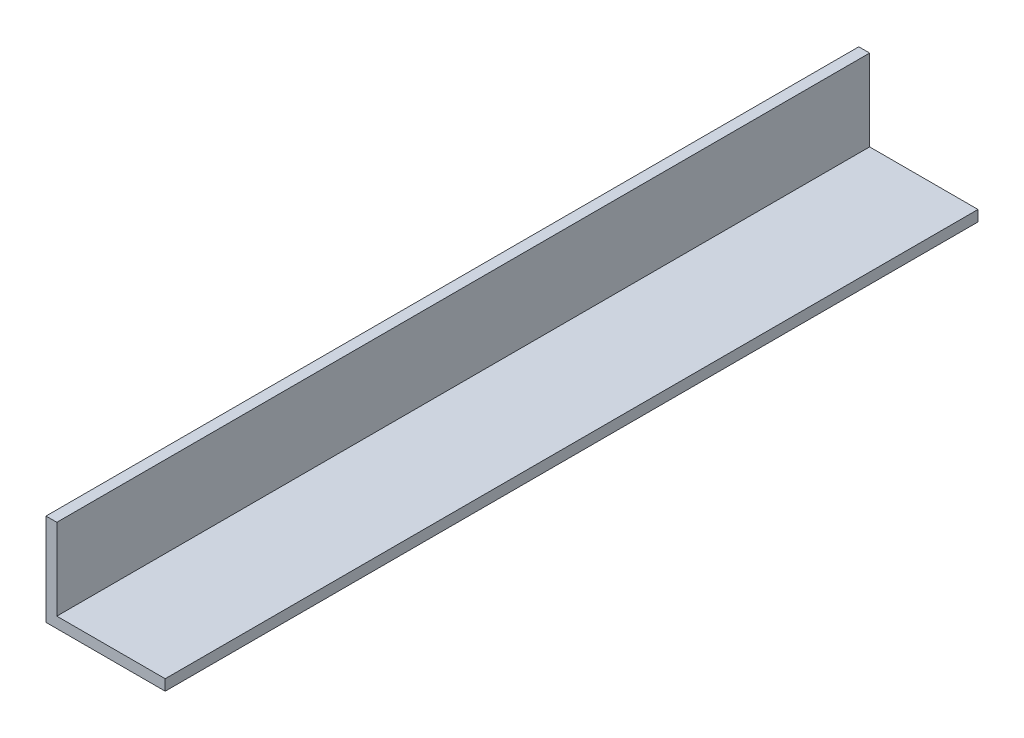
ISO-10303-21;
HEADER;
FILE_DESCRIPTION(('STEP AP214'),'2;1');
FILE_NAME('part.step','',(''),(''),'','','');
FILE_SCHEMA(('AUTOMOTIVE_DESIGN { 1 0 10303 214 1 1 1 1 }'));
ENDSEC;
DATA;
#1=APPLICATION_CONTEXT('core data for automotive mechanical design processes');
#2=APPLICATION_PROTOCOL_DEFINITION('international standard','automotive_design',2000,#1);
#3=PRODUCT_CONTEXT('',#1,'mechanical');
#4=PRODUCT('Part','Part','',(#3));
#5=PRODUCT_RELATED_PRODUCT_CATEGORY('part','',(#4));
#6=PRODUCT_DEFINITION_FORMATION('','',#4);
#7=PRODUCT_DEFINITION_CONTEXT('part definition',#1,'design');
#8=PRODUCT_DEFINITION('design','',#6,#7);
#9=PRODUCT_DEFINITION_SHAPE('','',#8);
#10=(LENGTH_UNIT() NAMED_UNIT(*) SI_UNIT(.MILLI.,.METRE.));
#11=(NAMED_UNIT(*) PLANE_ANGLE_UNIT() SI_UNIT($,.RADIAN.));
#12=(NAMED_UNIT(*) SI_UNIT($,.STERADIAN.) SOLID_ANGLE_UNIT());
#13=UNCERTAINTY_MEASURE_WITH_UNIT(LENGTH_MEASURE(1.E-05),#10,'distance_accuracy_value','');
#14=(GEOMETRIC_REPRESENTATION_CONTEXT(3) GLOBAL_UNCERTAINTY_ASSIGNED_CONTEXT((#13)) GLOBAL_UNIT_ASSIGNED_CONTEXT((#10,
#11,#12)) REPRESENTATION_CONTEXT('',''));
#15=CARTESIAN_POINT('',(0.,0.,0.));
#16=DIRECTION('',(0.,0.,1.));
#17=DIRECTION('',(1.,0.,0.));
#18=AXIS2_PLACEMENT_3D('',#15,#16,#17);
#19=CARTESIAN_POINT('',(22.,0.,150.));
#20=DIRECTION('',(0.,1.,0.));
#21=DIRECTION('',(-1.,0.,0.));
#22=AXIS2_PLACEMENT_3D('',#19,#20,#21);
#23=PLANE('',#22);
#24=DIRECTION('',(1.,0.,0.));
#25=VECTOR('',#24,1.);
#26=CARTESIAN_POINT('',(22.,0.,0.));
#27=LINE('',#26,#25);
#28=CARTESIAN_POINT('',(0.,0.,0.));
#29=VERTEX_POINT('',#28);
#30=CARTESIAN_POINT('',(22.,0.,0.));
#31=VERTEX_POINT('',#30);
#32=EDGE_CURVE('E125',#29,#31,#27,.T.);
#33=ORIENTED_EDGE('',*,*,#32,.T.);
#34=DIRECTION('',(0.,0.,-1.));
#35=VECTOR('',#34,1.);
#36=CARTESIAN_POINT('',(22.,0.,150.));
#37=LINE('',#36,#35);
#38=CARTESIAN_POINT('',(22.,0.,150.));
#39=VERTEX_POINT('',#38);
#40=EDGE_CURVE('E11',#39,#31,#37,.T.);
#41=ORIENTED_EDGE('',*,*,#40,.F.);
#42=DIRECTION('',(1.,0.,0.));
#43=VECTOR('',#42,1.);
#44=CARTESIAN_POINT('',(22.,0.,150.));
#45=LINE('',#44,#43);
#46=CARTESIAN_POINT('',(0.,0.,150.));
#47=VERTEX_POINT('',#46);
#48=EDGE_CURVE('E135',#47,#39,#45,.T.);
#49=ORIENTED_EDGE('',*,*,#48,.F.);
#50=DIRECTION('',(0.,0.,-1.));
#51=VECTOR('',#50,1.);
#52=CARTESIAN_POINT('',(0.,0.,150.));
#53=LINE('',#52,#51);
#54=EDGE_CURVE('E121',#47,#29,#53,.T.);
#55=ORIENTED_EDGE('',*,*,#54,.T.);
#56=EDGE_LOOP('',(#33,#41,#49,#55));
#57=FACE_BOUND('',#56,.T.);
#58=ADVANCED_FACE('F41',(#57),#23,.F.);
#59=CARTESIAN_POINT('',(22.,2.,150.));
#60=DIRECTION('',(-1.,0.,0.));
#61=DIRECTION('',(0.,0.,1.));
#62=AXIS2_PLACEMENT_3D('',#59,#60,#61);
#63=PLANE('',#62);
#64=DIRECTION('',(0.,1.,0.));
#65=VECTOR('',#64,1.);
#66=CARTESIAN_POINT('',(22.,2.,0.));
#67=LINE('',#66,#65);
#68=CARTESIAN_POINT('',(22.,2.,0.));
#69=VERTEX_POINT('',#68);
#70=EDGE_CURVE('E128',#31,#69,#67,.T.);
#71=ORIENTED_EDGE('',*,*,#70,.T.);
#72=DIRECTION('',(0.,0.,-1.));
#73=VECTOR('',#72,1.);
#74=CARTESIAN_POINT('',(22.,2.,150.));
#75=LINE('',#74,#73);
#76=CARTESIAN_POINT('',(22.,2.,150.));
#77=VERTEX_POINT('',#76);
#78=EDGE_CURVE('E49',#77,#69,#75,.T.);
#79=ORIENTED_EDGE('',*,*,#78,.F.);
#80=DIRECTION('',(0.,1.,0.));
#81=VECTOR('',#80,1.);
#82=CARTESIAN_POINT('',(22.,2.,150.));
#83=LINE('',#82,#81);
#84=EDGE_CURVE('E94',#39,#77,#83,.T.);
#85=ORIENTED_EDGE('',*,*,#84,.F.);
#86=ORIENTED_EDGE('',*,*,#40,.T.);
#87=EDGE_LOOP('',(#71,#79,#85,#86));
#88=FACE_BOUND('',#87,.T.);
#89=ADVANCED_FACE('F159',(#88),#63,.F.);
#90=CARTESIAN_POINT('',(2.,2.,150.));
#91=DIRECTION('',(0.,-1.,0.));
#92=DIRECTION('',(0.,0.,-1.));
#93=AXIS2_PLACEMENT_3D('',#90,#91,#92);
#94=PLANE('',#93);
#95=DIRECTION('',(-1.,0.,0.));
#96=VECTOR('',#95,1.);
#97=CARTESIAN_POINT('',(2.,2.,0.));
#98=LINE('',#97,#96);
#99=CARTESIAN_POINT('',(2.,2.,0.));
#100=VERTEX_POINT('',#99);
#101=EDGE_CURVE('E130',#69,#100,#98,.T.);
#102=ORIENTED_EDGE('',*,*,#101,.T.);
#103=DIRECTION('',(0.,0.,-1.));
#104=VECTOR('',#103,1.);
#105=CARTESIAN_POINT('',(2.,2.,150.));
#106=LINE('',#105,#104);
#107=CARTESIAN_POINT('',(2.,2.,150.));
#108=VERTEX_POINT('',#107);
#109=EDGE_CURVE('E116',#108,#100,#106,.T.);
#110=ORIENTED_EDGE('',*,*,#109,.F.);
#111=DIRECTION('',(-1.,0.,0.));
#112=VECTOR('',#111,1.);
#113=CARTESIAN_POINT('',(2.,2.,150.));
#114=LINE('',#113,#112);
#115=EDGE_CURVE('E107',#77,#108,#114,.T.);
#116=ORIENTED_EDGE('',*,*,#115,.F.);
#117=ORIENTED_EDGE('',*,*,#78,.T.);
#118=EDGE_LOOP('',(#102,#110,#116,#117));
#119=FACE_BOUND('',#118,.T.);
#120=ADVANCED_FACE('F141',(#119),#94,.F.);
#121=CARTESIAN_POINT('',(2.,17.,150.));
#122=DIRECTION('',(-1.,0.,0.));
#123=DIRECTION('',(0.,-1.,0.));
#124=AXIS2_PLACEMENT_3D('',#121,#122,#123);
#125=PLANE('',#124);
#126=DIRECTION('',(0.,1.,0.));
#127=VECTOR('',#126,1.);
#128=CARTESIAN_POINT('',(2.,17.,0.));
#129=LINE('',#128,#127);
#130=CARTESIAN_POINT('',(2.,17.,0.));
#131=VERTEX_POINT('',#130);
#132=EDGE_CURVE('E115',#100,#131,#129,.T.);
#133=ORIENTED_EDGE('',*,*,#132,.T.);
#134=DIRECTION('',(0.,0.,-1.));
#135=VECTOR('',#134,1.);
#136=CARTESIAN_POINT('',(2.,17.,150.));
#137=LINE('',#136,#135);
#138=CARTESIAN_POINT('',(2.,17.,150.));
#139=VERTEX_POINT('',#138);
#140=EDGE_CURVE('E112',#139,#131,#137,.T.);
#141=ORIENTED_EDGE('',*,*,#140,.F.);
#142=DIRECTION('',(0.,1.,0.));
#143=VECTOR('',#142,1.);
#144=CARTESIAN_POINT('',(2.,17.,150.));
#145=LINE('',#144,#143);
#146=EDGE_CURVE('E101',#108,#139,#145,.T.);
#147=ORIENTED_EDGE('',*,*,#146,.F.);
#148=ORIENTED_EDGE('',*,*,#109,.T.);
#149=EDGE_LOOP('',(#133,#141,#147,#148));
#150=FACE_BOUND('',#149,.T.);
#151=ADVANCED_FACE('F113',(#150),#125,.F.);
#152=CARTESIAN_POINT('',(0.,17.,150.));
#153=DIRECTION('',(0.,-1.,0.));
#154=DIRECTION('',(0.,0.,-1.));
#155=AXIS2_PLACEMENT_3D('',#152,#153,#154);
#156=PLANE('',#155);
#157=DIRECTION('',(-1.,0.,0.));
#158=VECTOR('',#157,1.);
#159=CARTESIAN_POINT('',(0.,17.,0.));
#160=LINE('',#159,#158);
#161=CARTESIAN_POINT('',(0.,17.,0.));
#162=VERTEX_POINT('',#161);
#163=EDGE_CURVE('E80',#131,#162,#160,.T.);
#164=ORIENTED_EDGE('',*,*,#163,.T.);
#165=DIRECTION('',(0.,0.,-1.));
#166=VECTOR('',#165,1.);
#167=CARTESIAN_POINT('',(0.,17.,150.));
#168=LINE('',#167,#166);
#169=CARTESIAN_POINT('',(0.,17.,150.));
#170=VERTEX_POINT('',#169);
#171=EDGE_CURVE('E117',#170,#162,#168,.T.);
#172=ORIENTED_EDGE('',*,*,#171,.F.);
#173=DIRECTION('',(-1.,0.,0.));
#174=VECTOR('',#173,1.);
#175=CARTESIAN_POINT('',(0.,17.,150.));
#176=LINE('',#175,#174);
#177=EDGE_CURVE('E105',#139,#170,#176,.T.);
#178=ORIENTED_EDGE('',*,*,#177,.F.);
#179=ORIENTED_EDGE('',*,*,#140,.T.);
#180=EDGE_LOOP('',(#164,#172,#178,#179));
#181=FACE_BOUND('',#180,.T.);
#182=ADVANCED_FACE('F119',(#181),#156,.F.);
#183=CARTESIAN_POINT('',(0.,0.,150.));
#184=DIRECTION('',(1.,0.,0.));
#185=DIRECTION('',(0.,0.,-1.));
#186=AXIS2_PLACEMENT_3D('',#183,#184,#185);
#187=PLANE('',#186);
#188=DIRECTION('',(0.,-1.,0.));
#189=VECTOR('',#188,1.);
#190=CARTESIAN_POINT('',(0.,0.,0.));
#191=LINE('',#190,#189);
#192=EDGE_CURVE('E86',#162,#29,#191,.T.);
#193=ORIENTED_EDGE('',*,*,#192,.T.);
#194=ORIENTED_EDGE('',*,*,#54,.F.);
#195=DIRECTION('',(0.,-1.,0.));
#196=VECTOR('',#195,1.);
#197=CARTESIAN_POINT('',(0.,0.,150.));
#198=LINE('',#197,#196);
#199=EDGE_CURVE('E57',#170,#47,#198,.T.);
#200=ORIENTED_EDGE('',*,*,#199,.F.);
#201=ORIENTED_EDGE('',*,*,#171,.T.);
#202=EDGE_LOOP('',(#193,#194,#200,#201));
#203=FACE_BOUND('',#202,.T.);
#204=ADVANCED_FACE('F148',(#203),#187,.F.);
#205=CARTESIAN_POINT('',(0.,0.,150.));
#206=DIRECTION('',(0.,0.,-1.));
#207=DIRECTION('',(-1.,0.,0.));
#208=AXIS2_PLACEMENT_3D('',#205,#206,#207);
#209=PLANE('',#208);
#210=ORIENTED_EDGE('',*,*,#48,.T.);
#211=ORIENTED_EDGE('',*,*,#84,.T.);
#212=ORIENTED_EDGE('',*,*,#115,.T.);
#213=ORIENTED_EDGE('',*,*,#146,.T.);
#214=ORIENTED_EDGE('',*,*,#177,.T.);
#215=ORIENTED_EDGE('',*,*,#199,.T.);
#216=EDGE_LOOP('',(#210,#211,#212,#213,#214,#215));
#217=FACE_BOUND('',#216,.T.);
#218=ADVANCED_FACE('F103',(#217),#209,.F.);
#219=CARTESIAN_POINT('',(0.,0.,0.));
#220=DIRECTION('',(0.,0.,-1.));
#221=DIRECTION('',(-1.,0.,0.));
#222=AXIS2_PLACEMENT_3D('',#219,#220,#221);
#223=PLANE('',#222);
#224=ORIENTED_EDGE('',*,*,#32,.F.);
#225=ORIENTED_EDGE('',*,*,#192,.F.);
#226=ORIENTED_EDGE('',*,*,#163,.F.);
#227=ORIENTED_EDGE('',*,*,#132,.F.);
#228=ORIENTED_EDGE('',*,*,#101,.F.);
#229=ORIENTED_EDGE('',*,*,#70,.F.);
#230=EDGE_LOOP('',(#224,#225,#226,#227,#228,#229));
#231=FACE_BOUND('',#230,.T.);
#232=ADVANCED_FACE('F144',(#231),#223,.T.);
#233=CLOSED_SHELL('',(#58,#89,#120,#151,#182,#204,#218,#232));
#234=MANIFOLD_SOLID_BREP('B2',#233);
#235=ADVANCED_BREP_SHAPE_REPRESENTATION('',(#18,#234),#14);
#236=SHAPE_DEFINITION_REPRESENTATION(#9,#235);
ENDSEC;
END-ISO-10303-21;
